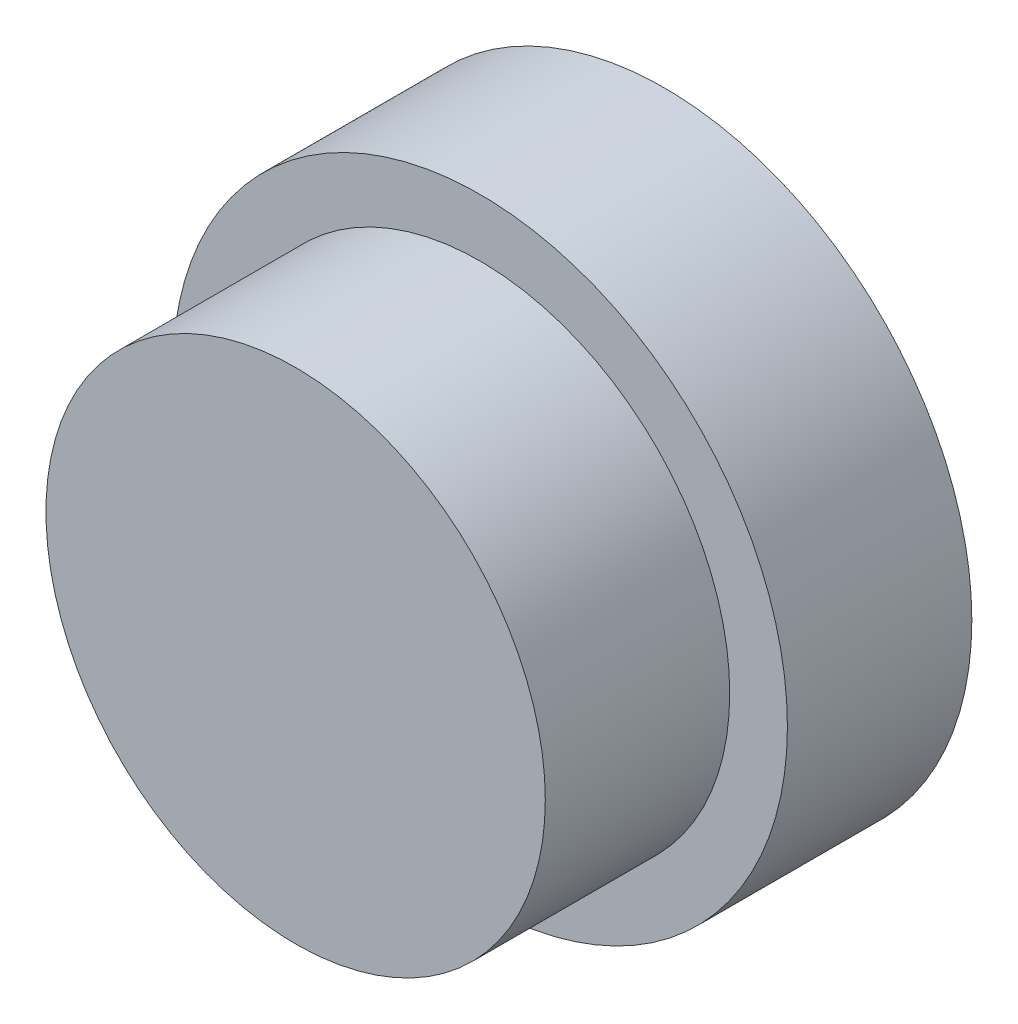
ISO-10303-21;
HEADER;
FILE_DESCRIPTION(('STEP AP214'),'2;1');
FILE_NAME('part.step','',(''),(''),'','','');
FILE_SCHEMA(('AUTOMOTIVE_DESIGN { 1 0 10303 214 1 1 1 1 }'));
ENDSEC;
DATA;
#1=APPLICATION_CONTEXT('core data for automotive mechanical design processes');
#2=APPLICATION_PROTOCOL_DEFINITION('international standard','automotive_design',2000,#1);
#3=PRODUCT_CONTEXT('',#1,'mechanical');
#4=PRODUCT('Part','Part','',(#3));
#5=PRODUCT_RELATED_PRODUCT_CATEGORY('part','',(#4));
#6=PRODUCT_DEFINITION_FORMATION('','',#4);
#7=PRODUCT_DEFINITION_CONTEXT('part definition',#1,'design');
#8=PRODUCT_DEFINITION('design','',#6,#7);
#9=PRODUCT_DEFINITION_SHAPE('','',#8);
#10=(LENGTH_UNIT() NAMED_UNIT(*) SI_UNIT(.MILLI.,.METRE.));
#11=(NAMED_UNIT(*) PLANE_ANGLE_UNIT() SI_UNIT($,.RADIAN.));
#12=(NAMED_UNIT(*) SI_UNIT($,.STERADIAN.) SOLID_ANGLE_UNIT());
#13=UNCERTAINTY_MEASURE_WITH_UNIT(LENGTH_MEASURE(1.E-05),#10,'distance_accuracy_value','');
#14=(GEOMETRIC_REPRESENTATION_CONTEXT(3) GLOBAL_UNCERTAINTY_ASSIGNED_CONTEXT((#13)) GLOBAL_UNIT_ASSIGNED_CONTEXT((#10,
#11,#12)) REPRESENTATION_CONTEXT('',''));
#15=CARTESIAN_POINT('',(0.,0.,0.));
#16=DIRECTION('',(0.,0.,1.));
#17=DIRECTION('',(1.,0.,0.));
#18=AXIS2_PLACEMENT_3D('',#15,#16,#17);
#19=CARTESIAN_POINT('',(0.,0.,3.));
#20=DIRECTION('',(0.,0.,-1.));
#21=DIRECTION('',(-1.,0.,0.));
#22=AXIS2_PLACEMENT_3D('',#19,#20,#21);
#23=CYLINDRICAL_SURFACE('',#22,5.);
#24=CARTESIAN_POINT('',(0.,0.,3.));
#25=DIRECTION('',(0.,0.,1.));
#26=DIRECTION('',(1.,0.,0.));
#27=AXIS2_PLACEMENT_3D('',#24,#25,#26);
#28=CIRCLE('',#27,5.);
#29=CARTESIAN_POINT('',(5.,0.,3.));
#30=VERTEX_POINT('',#29);
#31=EDGE_CURVE('E39',#30,#30,#28,.T.);
#32=ORIENTED_EDGE('',*,*,#31,.F.);
#33=EDGE_LOOP('',(#32));
#34=FACE_BOUND('',#33,.T.);
#35=CARTESIAN_POINT('',(0.,0.,0.));
#36=DIRECTION('',(0.,0.,1.));
#37=DIRECTION('',(1.,0.,0.));
#38=AXIS2_PLACEMENT_3D('',#35,#36,#37);
#39=CIRCLE('',#38,5.);
#40=CARTESIAN_POINT('',(5.,0.,0.));
#41=VERTEX_POINT('',#40);
#42=EDGE_CURVE('E35',#41,#41,#39,.T.);
#43=ORIENTED_EDGE('',*,*,#42,.T.);
#44=EDGE_LOOP('',(#43));
#45=FACE_BOUND('',#44,.T.);
#46=ADVANCED_FACE('F32',(#34,#45),#23,.T.);
#47=CARTESIAN_POINT('',(0.,0.,3.));
#48=DIRECTION('',(0.,0.,1.));
#49=DIRECTION('',(1.,0.,0.));
#50=AXIS2_PLACEMENT_3D('',#47,#48,#49);
#51=PLANE('',#50);
#52=CARTESIAN_POINT('',(0.,0.,3.));
#53=DIRECTION('',(0.,0.,1.));
#54=DIRECTION('',(1.,0.,0.));
#55=AXIS2_PLACEMENT_3D('',#52,#53,#54);
#56=CIRCLE('',#55,4.06136578656242);
#57=CARTESIAN_POINT('',(4.06136578656242,0.,3.));
#58=VERTEX_POINT('',#57);
#59=EDGE_CURVE('E10',#58,#58,#56,.T.);
#60=ORIENTED_EDGE('',*,*,#59,.F.);
#61=EDGE_LOOP('',(#60));
#62=FACE_BOUND('',#61,.T.);
#63=ORIENTED_EDGE('',*,*,#31,.T.);
#64=EDGE_LOOP('',(#63));
#65=FACE_BOUND('',#64,.T.);
#66=ADVANCED_FACE('F56',(#62,#65),#51,.T.);
#67=CARTESIAN_POINT('',(0.,0.,0.));
#68=DIRECTION('',(0.,0.,1.));
#69=DIRECTION('',(1.,0.,0.));
#70=AXIS2_PLACEMENT_3D('',#67,#68,#69);
#71=PLANE('',#70);
#72=ORIENTED_EDGE('',*,*,#42,.F.);
#73=EDGE_LOOP('',(#72));
#74=FACE_BOUND('',#73,.T.);
#75=ADVANCED_FACE('F53',(#74),#71,.F.);
#76=CARTESIAN_POINT('',(0.,0.,6.));
#77=DIRECTION('',(0.,0.,-1.));
#78=DIRECTION('',(-1.,0.,0.));
#79=AXIS2_PLACEMENT_3D('',#76,#77,#78);
#80=CYLINDRICAL_SURFACE('',#79,4.06136578656242);
#81=CARTESIAN_POINT('',(0.,0.,6.));
#82=DIRECTION('',(0.,0.,1.));
#83=DIRECTION('',(1.,0.,0.));
#84=AXIS2_PLACEMENT_3D('',#81,#82,#83);
#85=CIRCLE('',#84,4.06136578656242);
#86=CARTESIAN_POINT('',(4.06136578656242,0.,6.));
#87=VERTEX_POINT('',#86);
#88=EDGE_CURVE('E45',#87,#87,#85,.T.);
#89=ORIENTED_EDGE('',*,*,#88,.F.);
#90=EDGE_LOOP('',(#89));
#91=FACE_BOUND('',#90,.T.);
#92=ORIENTED_EDGE('',*,*,#59,.T.);
#93=EDGE_LOOP('',(#92));
#94=FACE_BOUND('',#93,.T.);
#95=ADVANCED_FACE('F55',(#91,#94),#80,.T.);
#96=CARTESIAN_POINT('',(0.,0.,6.));
#97=DIRECTION('',(0.,0.,1.));
#98=DIRECTION('',(1.,0.,0.));
#99=AXIS2_PLACEMENT_3D('',#96,#97,#98);
#100=PLANE('',#99);
#101=ORIENTED_EDGE('',*,*,#88,.T.);
#102=EDGE_LOOP('',(#101));
#103=FACE_BOUND('',#102,.T.);
#104=ADVANCED_FACE('F61',(#103),#100,.T.);
#105=CLOSED_SHELL('',(#46,#66,#75,#95,#104));
#106=MANIFOLD_SOLID_BREP('B2',#105);
#107=ADVANCED_BREP_SHAPE_REPRESENTATION('',(#18,#106),#14);
#108=SHAPE_DEFINITION_REPRESENTATION(#9,#107);
ENDSEC;
END-ISO-10303-21;
